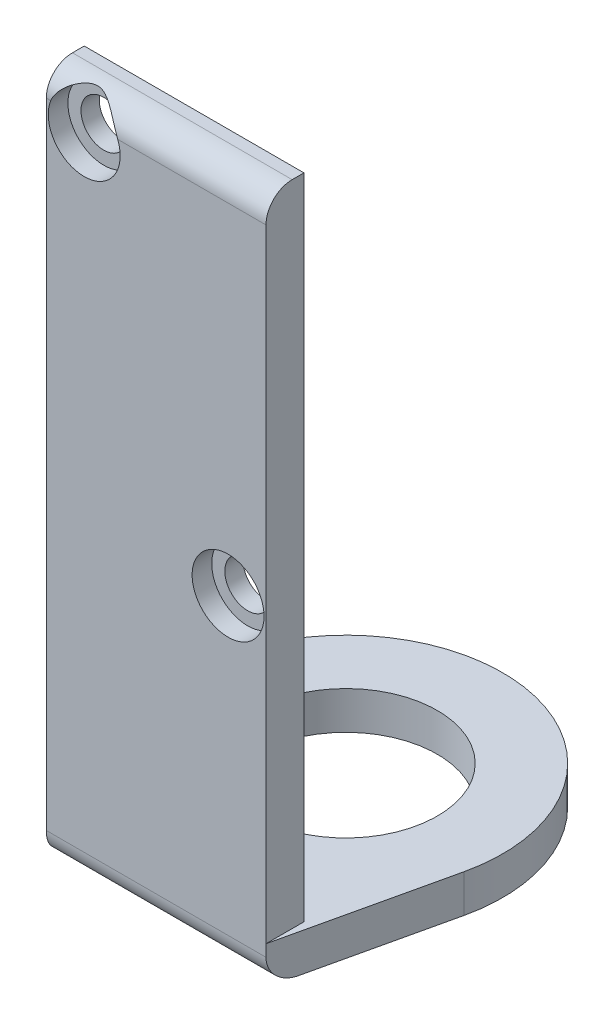
ISO-10303-21;
HEADER;
FILE_DESCRIPTION(('STEP AP214'),'2;1');
FILE_NAME('part.step','',(''),(''),'','','');
FILE_SCHEMA(('AUTOMOTIVE_DESIGN { 1 0 10303 214 1 1 1 1 }'));
ENDSEC;
DATA;
#1=APPLICATION_CONTEXT('core data for automotive mechanical design processes');
#2=APPLICATION_PROTOCOL_DEFINITION('international standard','automotive_design',2000,#1);
#3=PRODUCT_CONTEXT('',#1,'mechanical');
#4=PRODUCT('Part','Part','',(#3));
#5=PRODUCT_RELATED_PRODUCT_CATEGORY('part','',(#4));
#6=PRODUCT_DEFINITION_FORMATION('','',#4);
#7=PRODUCT_DEFINITION_CONTEXT('part definition',#1,'design');
#8=PRODUCT_DEFINITION('design','',#6,#7);
#9=PRODUCT_DEFINITION_SHAPE('','',#8);
#10=(LENGTH_UNIT() NAMED_UNIT(*) SI_UNIT(.MILLI.,.METRE.));
#11=(NAMED_UNIT(*) PLANE_ANGLE_UNIT() SI_UNIT($,.RADIAN.));
#12=(NAMED_UNIT(*) SI_UNIT($,.STERADIAN.) SOLID_ANGLE_UNIT());
#13=UNCERTAINTY_MEASURE_WITH_UNIT(LENGTH_MEASURE(1.E-05),#10,'distance_accuracy_value','');
#14=(GEOMETRIC_REPRESENTATION_CONTEXT(3) GLOBAL_UNCERTAINTY_ASSIGNED_CONTEXT((#13)) GLOBAL_UNIT_ASSIGNED_CONTEXT((#10,
#11,#12)) REPRESENTATION_CONTEXT('',''));
#15=CARTESIAN_POINT('',(0.,0.,0.));
#16=DIRECTION('',(0.,0.,1.));
#17=DIRECTION('',(1.,0.,0.));
#18=AXIS2_PLACEMENT_3D('',#15,#16,#17);
#19=CARTESIAN_POINT('',(2.86441659327707,-36.2659463247865,1.00000000000016));
#20=DIRECTION('',(-1.,0.,0.));
#21=DIRECTION('',(0.,0.,1.));
#22=AXIS2_PLACEMENT_3D('',#19,#20,#21);
#23=PLANE('',#22);
#24=DIRECTION('',(0.,1.,0.));
#25=VECTOR('',#24,1.);
#26=CARTESIAN_POINT('',(2.86441659327707,-36.2659463247865,3.00000000000017));
#27=LINE('',#26,#25);
#28=CARTESIAN_POINT('',(2.86441659327708,-16.3174859837467,3.00000000000022));
#29=VERTEX_POINT('',#28);
#30=CARTESIAN_POINT('',(2.86441659327706,31.2825140162684,3.00000000000017));
#31=VERTEX_POINT('',#30);
#32=EDGE_CURVE('E125',#29,#31,#27,.T.);
#33=ORIENTED_EDGE('',*,*,#32,.T.);
#34=CARTESIAN_POINT('',(2.86441659327706,31.2825140162684,1.00000000000017));
#35=DIRECTION('',(-1.,0.,0.));
#36=DIRECTION('',(0.,0.,1.));
#37=AXIS2_PLACEMENT_3D('',#34,#35,#36);
#38=CIRCLE('',#37,2.);
#39=CARTESIAN_POINT('',(2.86441659327706,33.2825140162684,1.00000000000017));
#40=VERTEX_POINT('',#39);
#41=EDGE_CURVE('E11',#31,#40,#38,.T.);
#42=ORIENTED_EDGE('',*,*,#41,.T.);
#43=DIRECTION('',(0.,0.,1.));
#44=VECTOR('',#43,1.);
#45=CARTESIAN_POINT('',(2.86441659327706,33.2825140162684,1.00000000000016));
#46=LINE('',#45,#44);
#47=CARTESIAN_POINT('',(2.86441659327706,33.2825140162684,0.100000000000007));
#48=VERTEX_POINT('',#47);
#49=EDGE_CURVE('E156',#48,#40,#46,.T.);
#50=ORIENTED_EDGE('',*,*,#49,.F.);
#51=DIRECTION('',(0.,1.,0.));
#52=VECTOR('',#51,1.);
#53=CARTESIAN_POINT('',(2.86441659327707,-36.2659463247865,0.100000000000007));
#54=LINE('',#53,#52);
#55=CARTESIAN_POINT('',(2.86441659327706,-16.3174859837467,0.100000000000007));
#56=VERTEX_POINT('',#55);
#57=EDGE_CURVE('E140',#56,#48,#54,.T.);
#58=ORIENTED_EDGE('',*,*,#57,.F.);
#59=DIRECTION('',(0.,0.,1.));
#60=VECTOR('',#59,1.);
#61=CARTESIAN_POINT('',(2.86441659327707,-16.3174859837467,1.00000000000014));
#62=LINE('',#61,#60);
#63=EDGE_CURVE('E131',#56,#29,#62,.T.);
#64=ORIENTED_EDGE('',*,*,#63,.T.);
#65=EDGE_LOOP('',(#33,#42,#50,#58,#64));
#66=FACE_BOUND('',#65,.T.);
#67=ADVANCED_FACE('F35',(#66),#23,.T.);
#68=CARTESIAN_POINT('',(19.6644165932771,-36.2659463247865,0.100000000000003));
#69=DIRECTION('',(0.,0.,-1.));
#70=DIRECTION('',(-1.,0.,0.));
#71=AXIS2_PLACEMENT_3D('',#68,#69,#70);
#72=PLANE('',#71);
#73=CARTESIAN_POINT('',(16.7644165932771,5.28251401626884,0.100000000000004));
#74=DIRECTION('',(0.,0.,-1.));
#75=DIRECTION('',(-1.,0.,0.));
#76=AXIS2_PLACEMENT_3D('',#73,#74,#75);
#77=CIRCLE('',#76,1.75000000000938);
#78=CARTESIAN_POINT('',(15.0144165932677,5.28251401626884,0.100000000000004));
#79=VERTEX_POINT('',#78);
#80=EDGE_CURVE('E160',#79,#79,#77,.F.);
#81=ORIENTED_EDGE('',*,*,#80,.T.);
#82=EDGE_LOOP('',(#81));
#83=FACE_BOUND('',#82,.T.);
#84=CARTESIAN_POINT('',(5.76441659327706,30.2825140162684,0.100000000000006));
#85=DIRECTION('',(0.,0.,-1.));
#86=DIRECTION('',(-1.,0.,0.));
#87=AXIS2_PLACEMENT_3D('',#84,#85,#86);
#88=CIRCLE('',#87,1.75000000000939);
#89=CARTESIAN_POINT('',(4.01441659326767,30.2825140162684,0.100000000000006));
#90=VERTEX_POINT('',#89);
#91=EDGE_CURVE('E270',#90,#90,#88,.F.);
#92=ORIENTED_EDGE('',*,*,#91,.T.);
#93=EDGE_LOOP('',(#92));
#94=FACE_BOUND('',#93,.T.);
#95=DIRECTION('',(0.,1.,0.));
#96=VECTOR('',#95,1.);
#97=CARTESIAN_POINT('',(19.6644165932771,-36.2659463247865,0.100000000000003));
#98=LINE('',#97,#96);
#99=CARTESIAN_POINT('',(19.6644165932771,-16.3174859837467,0.100000000000003));
#100=VERTEX_POINT('',#99);
#101=CARTESIAN_POINT('',(19.6644165932771,33.2825140162684,0.100000000000003));
#102=VERTEX_POINT('',#101);
#103=EDGE_CURVE('E148',#100,#102,#98,.T.);
#104=ORIENTED_EDGE('',*,*,#103,.F.);
#105=DIRECTION('',(-1.,0.,0.));
#106=VECTOR('',#105,1.);
#107=CARTESIAN_POINT('',(19.6644165932771,-16.3174859837467,0.100000000000003));
#108=LINE('',#107,#106);
#109=EDGE_CURVE('E142',#100,#56,#108,.T.);
#110=ORIENTED_EDGE('',*,*,#109,.T.);
#111=ORIENTED_EDGE('',*,*,#57,.T.);
#112=DIRECTION('',(-1.,0.,0.));
#113=VECTOR('',#112,1.);
#114=CARTESIAN_POINT('',(19.6644165932771,33.2825140162684,0.100000000000003));
#115=LINE('',#114,#113);
#116=EDGE_CURVE('E275',#102,#48,#115,.T.);
#117=ORIENTED_EDGE('',*,*,#116,.F.);
#118=EDGE_LOOP('',(#104,#110,#111,#117));
#119=FACE_BOUND('',#118,.T.);
#120=ADVANCED_FACE('F218',(#83,#94,#119),#72,.T.);
#121=CARTESIAN_POINT('',(19.6644165932771,-36.2659463247865,1.00000000000015));
#122=DIRECTION('',(1.,0.,0.));
#123=DIRECTION('',(0.,1.,0.));
#124=AXIS2_PLACEMENT_3D('',#121,#122,#123);
#125=PLANE('',#124);
#126=DIRECTION('',(0.,0.,-1.));
#127=VECTOR('',#126,1.);
#128=CARTESIAN_POINT('',(19.6644165932771,33.2825140162684,1.00000000000015));
#129=LINE('',#128,#127);
#130=CARTESIAN_POINT('',(19.6644165932771,33.2825140162684,1.00000000000017));
#131=VERTEX_POINT('',#130);
#132=EDGE_CURVE('E273',#131,#102,#129,.T.);
#133=ORIENTED_EDGE('',*,*,#132,.F.);
#134=CARTESIAN_POINT('',(19.6644165932771,31.2825140162684,1.00000000000017));
#135=DIRECTION('',(1.,0.,0.));
#136=DIRECTION('',(0.,1.,0.));
#137=AXIS2_PLACEMENT_3D('',#134,#135,#136);
#138=CIRCLE('',#137,2.);
#139=CARTESIAN_POINT('',(19.6644165932771,31.2825140162684,3.00000000000017));
#140=VERTEX_POINT('',#139);
#141=EDGE_CURVE('E57',#131,#140,#138,.T.);
#142=ORIENTED_EDGE('',*,*,#141,.T.);
#143=DIRECTION('',(0.,1.,0.));
#144=VECTOR('',#143,1.);
#145=CARTESIAN_POINT('',(19.6644165932771,-36.2659463247865,3.00000000000017));
#146=LINE('',#145,#144);
#147=CARTESIAN_POINT('',(19.6644165932771,-16.3174859837467,3.00000000000017));
#148=VERTEX_POINT('',#147);
#149=EDGE_CURVE('E124',#148,#140,#146,.T.);
#150=ORIENTED_EDGE('',*,*,#149,.F.);
#151=DIRECTION('',(0.,0.,-1.));
#152=VECTOR('',#151,1.);
#153=CARTESIAN_POINT('',(19.6644165932771,-16.3174859837467,1.00000000000013));
#154=LINE('',#153,#152);
#155=EDGE_CURVE('E167',#148,#100,#154,.T.);
#156=ORIENTED_EDGE('',*,*,#155,.T.);
#157=ORIENTED_EDGE('',*,*,#103,.T.);
#158=EDGE_LOOP('',(#133,#142,#150,#156,#157));
#159=FACE_BOUND('',#158,.T.);
#160=ADVANCED_FACE('F200',(#159),#125,.T.);
#161=CARTESIAN_POINT('',(16.7644165932771,5.28251401626884,0.0990000000000036));
#162=DIRECTION('',(0.,0.,1.));
#163=DIRECTION('',(1.,0.,0.));
#164=AXIS2_PLACEMENT_3D('',#161,#162,#163);
#165=CYLINDRICAL_SURFACE('',#164,1.75000000000938);
#166=ORIENTED_EDGE('',*,*,#80,.F.);
#167=EDGE_LOOP('',(#166));
#168=FACE_BOUND('',#167,.T.);
#169=CARTESIAN_POINT('',(16.7644165932771,5.28251401626884,1.50000000000017));
#170=DIRECTION('',(0.,0.,1.));
#171=DIRECTION('',(1.,0.,0.));
#172=AXIS2_PLACEMENT_3D('',#169,#170,#171);
#173=CIRCLE('',#172,1.75000000000938);
#174=CARTESIAN_POINT('',(18.5144165932865,5.28251401626884,1.50000000000017));
#175=VERTEX_POINT('',#174);
#176=EDGE_CURVE('E162',#175,#175,#173,.F.);
#177=ORIENTED_EDGE('',*,*,#176,.F.);
#178=EDGE_LOOP('',(#177));
#179=FACE_BOUND('',#178,.T.);
#180=ADVANCED_FACE('F196',(#168,#179),#165,.F.);
#181=CARTESIAN_POINT('',(5.76441659327706,30.2825140162684,0.0990000000000036));
#182=DIRECTION('',(0.,0.,1.));
#183=DIRECTION('',(1.,0.,0.));
#184=AXIS2_PLACEMENT_3D('',#181,#182,#183);
#185=CYLINDRICAL_SURFACE('',#184,1.75000000000939);
#186=ORIENTED_EDGE('',*,*,#91,.F.);
#187=EDGE_LOOP('',(#186));
#188=FACE_BOUND('',#187,.T.);
#189=CARTESIAN_POINT('',(5.76441659327706,30.2825140162684,1.50000000000017));
#190=DIRECTION('',(0.,0.,1.));
#191=DIRECTION('',(1.,0.,0.));
#192=AXIS2_PLACEMENT_3D('',#189,#190,#191);
#193=CIRCLE('',#192,1.75000000000939);
#194=CARTESIAN_POINT('',(7.51441659328646,30.2825140162684,1.50000000000017));
#195=VERTEX_POINT('',#194);
#196=EDGE_CURVE('E157',#195,#195,#193,.F.);
#197=ORIENTED_EDGE('',*,*,#196,.F.);
#198=EDGE_LOOP('',(#197));
#199=FACE_BOUND('',#198,.T.);
#200=ADVANCED_FACE('F199',(#188,#199),#185,.F.);
#201=CARTESIAN_POINT('',(19.6644165932771,-36.2659463247865,3.00000000000017));
#202=DIRECTION('',(0.,0.,1.));
#203=DIRECTION('',(1.,0.,0.));
#204=AXIS2_PLACEMENT_3D('',#201,#202,#203);
#205=PLANE('',#204);
#206=CARTESIAN_POINT('',(16.7644165932771,5.28251401626884,3.00000000000017));
#207=DIRECTION('',(0.,0.,1.));
#208=DIRECTION('',(1.,0.,0.));
#209=AXIS2_PLACEMENT_3D('',#206,#207,#208);
#210=CIRCLE('',#209,2.75000000000939);
#211=CARTESIAN_POINT('',(19.5144165932865,5.28251401626884,3.00000000000017));
#212=VERTEX_POINT('',#211);
#213=EDGE_CURVE('E141',#212,#212,#210,.T.);
#214=ORIENTED_EDGE('',*,*,#213,.F.);
#215=EDGE_LOOP('',(#214));
#216=FACE_BOUND('',#215,.T.);
#217=CARTESIAN_POINT('',(2.86441659327707,-17.2174859837469,3.00000000000017));
#218=VERTEX_POINT('',#217);
#219=EDGE_CURVE('E114',#218,#29,#27,.T.);
#220=ORIENTED_EDGE('',*,*,#219,.F.);
#221=DIRECTION('',(-1.,0.,0.));
#222=VECTOR('',#221,1.);
#223=CARTESIAN_POINT('',(19.6644165932771,-17.2174859837468,3.00000000000017));
#224=LINE('',#223,#222);
#225=CARTESIAN_POINT('',(19.6644165932771,-17.2174859837468,3.00000000000017));
#226=VERTEX_POINT('',#225);
#227=EDGE_CURVE('E177',#218,#226,#224,.F.);
#228=ORIENTED_EDGE('',*,*,#227,.T.);
#229=EDGE_CURVE('E151',#226,#148,#146,.T.);
#230=ORIENTED_EDGE('',*,*,#229,.T.);
#231=ORIENTED_EDGE('',*,*,#149,.T.);
#232=DIRECTION('',(1.,0.,0.));
#233=VECTOR('',#232,1.);
#234=CARTESIAN_POINT('',(2.86441659327706,31.2825140162684,3.00000000000017));
#235=LINE('',#234,#233);
#236=CARTESIAN_POINT('',(8.32615428477705,31.2825140162684,3.00000000000017));
#237=VERTEX_POINT('',#236);
#238=EDGE_CURVE('E175',#140,#237,#235,.F.);
#239=ORIENTED_EDGE('',*,*,#238,.T.);
#240=CARTESIAN_POINT('',(5.76441659327706,30.2825140162684,3.00000000000017));
#241=DIRECTION('',(0.,0.,1.));
#242=DIRECTION('',(1.,0.,0.));
#243=AXIS2_PLACEMENT_3D('',#240,#241,#242);
#244=CIRCLE('',#243,2.75000000000939);
#245=CARTESIAN_POINT('',(3.20267890177708,31.2825140162684,3.00000000000017));
#246=VERTEX_POINT('',#245);
#247=EDGE_CURVE('E165',#246,#237,#244,.T.);
#248=ORIENTED_EDGE('',*,*,#247,.F.);
#249=DIRECTION('',(1.,0.,0.));
#250=VECTOR('',#249,1.);
#251=CARTESIAN_POINT('',(2.86441659327706,31.2825140162684,3.00000000000017));
#252=LINE('',#251,#250);
#253=EDGE_CURVE('E147',#246,#31,#252,.F.);
#254=ORIENTED_EDGE('',*,*,#253,.T.);
#255=ORIENTED_EDGE('',*,*,#32,.F.);
#256=EDGE_LOOP('',(#220,#228,#230,#231,#239,#248,#254,#255));
#257=FACE_BOUND('',#256,.T.);
#258=ADVANCED_FACE('F144',(#216,#257),#205,.T.);
#259=CARTESIAN_POINT('',(0.,33.2825140162684,0.));
#260=DIRECTION('',(0.,-1.,0.));
#261=DIRECTION('',(0.,0.,-1.));
#262=AXIS2_PLACEMENT_3D('',#259,#260,#261);
#263=PLANE('',#262);
#264=ORIENTED_EDGE('',*,*,#49,.T.);
#265=DIRECTION('',(1.,0.,0.));
#266=VECTOR('',#265,1.);
#267=CARTESIAN_POINT('',(19.6644165932771,33.2825140162684,1.00000000000017));
#268=LINE('',#267,#266);
#269=EDGE_CURVE('E181',#40,#131,#268,.T.);
#270=ORIENTED_EDGE('',*,*,#269,.T.);
#271=ORIENTED_EDGE('',*,*,#132,.T.);
#272=ORIENTED_EDGE('',*,*,#116,.T.);
#273=EDGE_LOOP('',(#264,#270,#271,#272));
#274=FACE_BOUND('',#273,.T.);
#275=ADVANCED_FACE('F208',(#274),#263,.F.);
#276=CARTESIAN_POINT('',(10.7644165932771,-19.2174859837469,-12.));
#277=DIRECTION('',(0.,1.,0.));
#278=DIRECTION('',(0.,0.,-1.));
#279=AXIS2_PLACEMENT_3D('',#276,#277,#278);
#280=PLANE('',#279);
#281=DIRECTION('',(0.22139002929465,0.,-0.975185343885415));
#282=VECTOR('',#281,1.);
#283=CARTESIAN_POINT('',(19.6644165932771,-19.2174859837468,3.00000000000022));
#284=LINE('',#283,#282);
#285=CARTESIAN_POINT('',(20.1184636740352,-19.2174859837469,1.00000000000017));
#286=VERTEX_POINT('',#285);
#287=CARTESIAN_POINT('',(22.466640719902,-19.2174859837469,-9.3433196484642));
#288=VERTEX_POINT('',#287);
#289=EDGE_CURVE('E242',#286,#288,#284,.T.);
#290=ORIENTED_EDGE('',*,*,#289,.F.);
#291=DIRECTION('',(-1.,0.,0.));
#292=VECTOR('',#291,1.);
#293=CARTESIAN_POINT('',(2.86441659327708,-19.2174859837469,1.00000000000017));
#294=LINE('',#293,#292);
#295=CARTESIAN_POINT('',(2.24207839057973,-19.2174859837469,1.00000000000017));
#296=VERTEX_POINT('',#295);
#297=EDGE_CURVE('E170',#286,#296,#294,.T.);
#298=ORIENTED_EDGE('',*,*,#297,.T.);
#299=DIRECTION('',(0.297117037231068,0.,0.9548410685486));
#300=VECTOR('',#299,1.);
#301=CARTESIAN_POINT('',(2.86441659327708,-19.2174859837469,3.00000000000022));
#302=LINE('',#301,#300);
#303=CARTESIAN_POINT('',(-0.693676229306148,-19.2174859837469,-8.43459555322717));
#304=VERTEX_POINT('',#303);
#305=EDGE_CURVE('E248',#304,#296,#302,.T.);
#306=ORIENTED_EDGE('',*,*,#305,.F.);
#307=CARTESIAN_POINT('',(10.7644165932771,-19.2174859837469,-12.));
#308=DIRECTION('',(0.,1.,0.));
#309=DIRECTION('',(0.,0.,-1.));
#310=AXIS2_PLACEMENT_3D('',#307,#308,#309);
#311=CIRCLE('',#310,12.);
#312=EDGE_CURVE('E137',#288,#304,#311,.T.);
#313=ORIENTED_EDGE('',*,*,#312,.F.);
#314=EDGE_LOOP('',(#290,#298,#306,#313));
#315=FACE_BOUND('',#314,.T.);
#316=CARTESIAN_POINT('',(10.7644165932771,-19.2174859837469,-12.));
#317=DIRECTION('',(0.,1.,0.));
#318=DIRECTION('',(0.,0.,1.));
#319=AXIS2_PLACEMENT_3D('',#316,#317,#318);
#320=CIRCLE('',#319,7.);
#321=CARTESIAN_POINT('',(10.7644165932771,-19.2174859837469,-4.99999999999999));
#322=VERTEX_POINT('',#321);
#323=EDGE_CURVE('E289',#322,#322,#320,.T.);
#324=ORIENTED_EDGE('',*,*,#323,.T.);
#325=EDGE_LOOP('',(#324));
#326=FACE_BOUND('',#325,.T.);
#327=ADVANCED_FACE('F205',(#315,#326),#280,.F.);
#328=CARTESIAN_POINT('',(5.76441659327706,30.2825140162684,1.50000000000017));
#329=DIRECTION('',(0.,0.,1.));
#330=DIRECTION('',(1.,0.,0.));
#331=AXIS2_PLACEMENT_3D('',#328,#329,#330);
#332=PLANE('',#331);
#333=CARTESIAN_POINT('',(5.76441659327706,30.2825140162684,1.50000000000017));
#334=DIRECTION('',(0.,0.,1.));
#335=DIRECTION('',(1.,0.,0.));
#336=AXIS2_PLACEMENT_3D('',#333,#334,#335);
#337=CIRCLE('',#336,2.75000000000939);
#338=CARTESIAN_POINT('',(8.51441659328646,30.2825140162684,1.50000000000017));
#339=VERTEX_POINT('',#338);
#340=EDGE_CURVE('E161',#339,#339,#337,.T.);
#341=ORIENTED_EDGE('',*,*,#340,.T.);
#342=EDGE_LOOP('',(#341));
#343=FACE_BOUND('',#342,.T.);
#344=ORIENTED_EDGE('',*,*,#196,.T.);
#345=EDGE_LOOP('',(#344));
#346=FACE_BOUND('',#345,.T.);
#347=ADVANCED_FACE('F193',(#343,#346),#332,.T.);
#348=CARTESIAN_POINT('',(5.76441659327706,30.2825140162684,1.50000000000017));
#349=DIRECTION('',(0.,0.,1.));
#350=DIRECTION('',(1.,0.,0.));
#351=AXIS2_PLACEMENT_3D('',#348,#349,#350);
#352=CYLINDRICAL_SURFACE('',#351,2.75000000000939);
#353=ORIENTED_EDGE('',*,*,#340,.F.);
#354=EDGE_LOOP('',(#353));
#355=FACE_BOUND('',#354,.T.);
#356=ORIENTED_EDGE('',*,*,#247,.T.);
#357=CARTESIAN_POINT('',(8.32615428477705,31.2825140162684,3.00000000000017));
#358=CARTESIAN_POINT('',(8.30452704338385,31.337955904378,3.00000852369248));
#359=CARTESIAN_POINT('',(8.28108826760631,31.3926506547487,2.99769560487753));
#360=CARTESIAN_POINT('',(8.2309105158485,31.5000501880547,2.98886062477013));
#361=CARTESIAN_POINT('',(8.20417700900173,31.552758084086,2.98234546490591));
#362=CARTESIAN_POINT('',(8.14797340233813,31.6553006417317,2.96563019209358));
#363=CARTESIAN_POINT('',(8.11853694653143,31.705160688803,2.95547175494778));
#364=CARTESIAN_POINT('',(8.05696592038308,31.8023936199306,2.93189807840198));
#365=CARTESIAN_POINT('',(8.02483001968921,31.8497652587252,2.91848122694317));
#366=CARTESIAN_POINT('',(7.90900080611989,32.0096469444378,2.86696864585786));
#367=CARTESIAN_POINT('',(7.8190449810413,32.1153993070348,2.82161649066803));
#368=CARTESIAN_POINT('',(7.62734994122991,32.3100317653604,2.71941460914379));
#369=CARTESIAN_POINT('',(7.52554576098561,32.3988110374076,2.6625000821187));
#370=CARTESIAN_POINT('',(7.35127247501579,32.5300862435124,2.56448754168371));
#371=CARTESIAN_POINT('',(7.2815719218968,32.5776836338784,2.52514916290871));
#372=CARTESIAN_POINT('',(7.13848990763934,32.666104591524,2.44541371780702));
#373=CARTESIAN_POINT('',(7.06510622379961,32.7069240028232,2.40501601939601));
#374=CARTESIAN_POINT('',(6.91477503305728,32.7817574866422,2.32486501830934));
#375=CARTESIAN_POINT('',(6.83783286686256,32.815781374497,2.28511086356218));
#376=CARTESIAN_POINT('',(6.68003705868164,32.8769881543482,2.2083271538364));
#377=CARTESIAN_POINT('',(6.59918751241171,32.9041780319641,2.17129484426193));
#378=CARTESIAN_POINT('',(6.43546947698561,32.9506989041242,2.10398443229681));
#379=CARTESIAN_POINT('',(6.35273264495456,32.9702396692088,2.07353814371694));
#380=CARTESIAN_POINT('',(6.18315619938617,33.0018059480607,2.02222689994584));
#381=CARTESIAN_POINT('',(6.09633490415207,33.0138621090101,2.00132296611917));
#382=CARTESIAN_POINT('',(5.918098418569,33.0296869662474,1.97349161524413));
#383=CARTESIAN_POINT('',(5.82663230513074,33.0333216470894,1.96679035335539));
#384=CARTESIAN_POINT('',(5.64408734731845,33.0313993624084,1.97025612413238));
#385=CARTESIAN_POINT('',(5.55300886501071,33.0258351498295,1.98043645644484));
#386=CARTESIAN_POINT('',(5.35854900237038,33.0044696128244,2.01752643787803));
#387=CARTESIAN_POINT('',(5.25590831886375,32.9870041720115,2.04712024505191));
#388=CARTESIAN_POINT('',(5.05656228170143,32.9418343343866,2.11731478208368));
#389=CARTESIAN_POINT('',(4.95989152239799,32.9140757984321,2.15797340371131));
#390=CARTESIAN_POINT('',(4.78604386035443,32.8539797604965,2.23799647096404));
#391=CARTESIAN_POINT('',(4.70809186550209,32.8229174042064,2.27667072414631));
#392=CARTESIAN_POINT('',(4.5558517198757,32.7541237068913,2.35539637526769));
#393=CARTESIAN_POINT('',(4.4815659655352,32.7163880758425,2.39544864566629));
#394=CARTESIAN_POINT('',(4.33663575646437,32.6342932123739,2.47511505071361));
#395=CARTESIAN_POINT('',(4.26598711662967,32.5899418324789,2.51472964578124));
#396=CARTESIAN_POINT('',(4.12835305228039,32.4944836735656,2.59213957802046));
#397=CARTESIAN_POINT('',(4.06136769259927,32.4433767750416,2.62993488299248));
#398=CARTESIAN_POINT('',(3.90138683845221,32.3090865007862,2.71910066058679));
#399=CARTESIAN_POINT('',(3.81062911715411,32.2219740661301,2.76870136314684));
#400=CARTESIAN_POINT('',(3.63993798046842,32.0332770377424,2.85664637705634));
#401=CARTESIAN_POINT('',(3.55995931896675,31.9317568607724,2.89503858326532));
#402=CARTESIAN_POINT('',(3.43067515146286,31.7406360633689,2.94871728272862));
#403=CARTESIAN_POINT('',(3.37858629614221,31.6538818970884,2.96731915110423));
#404=CARTESIAN_POINT('',(3.30728471081157,31.5184913189292,2.98655960537461));
#405=CARTESIAN_POINT('',(3.28457488141028,31.4722780624481,2.99153175714972));
#406=CARTESIAN_POINT('',(3.24168079361082,31.3784048565201,2.99825536698567));
#407=CARTESIAN_POINT('',(3.22149945946799,31.3307433097903,3.0000031274438));
#408=CARTESIAN_POINT('',(3.20267890177708,31.2825140162684,3.00000000000017));
#409=B_SPLINE_CURVE_WITH_KNOTS('',3,(#357,#358,#359,#360,#361,#362,#363,#364,#365,#366,#367,
#368,#369,#370,#371,#372,#373,#374,#375,#376,#377,#378,#379,#380,#381,#382,#383,#384,#385,#386,
#387,#388,#389,#390,#391,#392,#393,#394,#395,#396,#397,#398,#399,#400,#401,#402,#403,#404,#405,
#406,#407,#408),.UNSPECIFIED.,.F.,.F.,(4,2,2,2,2,2,2,2,2,2,2,2,2,2,2,2,2,2,2,2,2,2,2,2,2,4),(0.,
0.178400172094682,0.356508097326478,0.532640415661562,0.708860051360818,1.14446861768259,
1.58258943914762,1.86164734563551,2.14087573222393,2.41969784223201,2.69823377476327,
2.96848176772644,3.23761574955367,3.51100402923823,3.7846077918436,4.10751728460334,
4.43214986626284,4.70900533173949,4.9860394296044,5.26274728211638,5.53946003027491,
5.94368044090571,6.34614741685465,6.65357405353709,6.80860273632975,6.96380908955771),.UNSPECIFIED.);
#410=EDGE_CURVE('E44',#237,#246,#409,.T.);
#411=ORIENTED_EDGE('',*,*,#410,.T.);
#412=EDGE_LOOP('',(#356,#411));
#413=FACE_BOUND('',#412,.T.);
#414=ADVANCED_FACE('F187',(#355,#413),#352,.F.);
#415=CARTESIAN_POINT('',(16.7644165932771,5.28251401626884,1.50000000000017));
#416=DIRECTION('',(0.,0.,1.));
#417=DIRECTION('',(1.,0.,0.));
#418=AXIS2_PLACEMENT_3D('',#415,#416,#417);
#419=PLANE('',#418);
#420=CARTESIAN_POINT('',(16.7644165932771,5.28251401626884,1.50000000000017));
#421=DIRECTION('',(0.,0.,1.));
#422=DIRECTION('',(1.,0.,0.));
#423=AXIS2_PLACEMENT_3D('',#420,#421,#422);
#424=CIRCLE('',#423,2.75000000000939);
#425=CARTESIAN_POINT('',(19.5144165932865,5.28251401626884,1.50000000000017));
#426=VERTEX_POINT('',#425);
#427=EDGE_CURVE('E166',#426,#426,#424,.T.);
#428=ORIENTED_EDGE('',*,*,#427,.T.);
#429=EDGE_LOOP('',(#428));
#430=FACE_BOUND('',#429,.T.);
#431=ORIENTED_EDGE('',*,*,#176,.T.);
#432=EDGE_LOOP('',(#431));
#433=FACE_BOUND('',#432,.T.);
#434=ADVANCED_FACE('F192',(#430,#433),#419,.T.);
#435=CARTESIAN_POINT('',(16.7644165932771,5.28251401626884,1.50000000000017));
#436=DIRECTION('',(0.,0.,1.));
#437=DIRECTION('',(1.,0.,0.));
#438=AXIS2_PLACEMENT_3D('',#435,#436,#437);
#439=CYLINDRICAL_SURFACE('',#438,2.75000000000939);
#440=ORIENTED_EDGE('',*,*,#427,.F.);
#441=EDGE_LOOP('',(#440));
#442=FACE_BOUND('',#441,.T.);
#443=ORIENTED_EDGE('',*,*,#213,.T.);
#444=EDGE_LOOP('',(#443));
#445=FACE_BOUND('',#444,.T.);
#446=ADVANCED_FACE('F296',(#442,#445),#439,.F.);
#447=CARTESIAN_POINT('',(10.764416593277,-16.3174859837467,-12.));
#448=DIRECTION('',(0.,-1.,0.));
#449=DIRECTION('',(0.,0.,-1.));
#450=AXIS2_PLACEMENT_3D('',#447,#448,#449);
#451=PLANE('',#450);
#452=ORIENTED_EDGE('',*,*,#63,.F.);
#453=ORIENTED_EDGE('',*,*,#109,.F.);
#454=ORIENTED_EDGE('',*,*,#155,.F.);
#455=DIRECTION('',(0.22139002929465,0.,-0.975185343885415));
#456=VECTOR('',#455,1.);
#457=CARTESIAN_POINT('',(19.6644165932771,-16.3174859837467,3.00000000000021));
#458=LINE('',#457,#456);
#459=CARTESIAN_POINT('',(22.466640719902,-16.3174859837467,-9.3433196484642));
#460=VERTEX_POINT('',#459);
#461=EDGE_CURVE('E136',#148,#460,#458,.T.);
#462=ORIENTED_EDGE('',*,*,#461,.T.);
#463=CARTESIAN_POINT('',(10.764416593277,-16.3174859837467,-12.));
#464=DIRECTION('',(0.,1.,0.));
#465=DIRECTION('',(0.,0.,-1.));
#466=AXIS2_PLACEMENT_3D('',#463,#464,#465);
#467=CIRCLE('',#466,12.);
#468=CARTESIAN_POINT('',(-0.693676229306149,-16.3174859837467,-8.43459555322717));
#469=VERTEX_POINT('',#468);
#470=EDGE_CURVE('E134',#460,#469,#467,.T.);
#471=ORIENTED_EDGE('',*,*,#470,.T.);
#472=DIRECTION('',(0.297117037231068,0.,0.9548410685486));
#473=VECTOR('',#472,1.);
#474=CARTESIAN_POINT('',(2.86441659327708,-16.3174859837467,3.00000000000022));
#475=LINE('',#474,#473);
#476=EDGE_CURVE('E119',#469,#29,#475,.T.);
#477=ORIENTED_EDGE('',*,*,#476,.T.);
#478=EDGE_LOOP('',(#452,#453,#454,#462,#471,#477));
#479=FACE_BOUND('',#478,.T.);
#480=CARTESIAN_POINT('',(10.7644165932771,-16.3174859837467,-12.));
#481=DIRECTION('',(0.,1.,0.));
#482=DIRECTION('',(0.,0.,1.));
#483=AXIS2_PLACEMENT_3D('',#480,#481,#482);
#484=CIRCLE('',#483,7.);
#485=CARTESIAN_POINT('',(10.7644165932771,-16.3174859837467,-4.99999999999999));
#486=VERTEX_POINT('',#485);
#487=EDGE_CURVE('E251',#486,#486,#484,.T.);
#488=ORIENTED_EDGE('',*,*,#487,.F.);
#489=EDGE_LOOP('',(#488));
#490=FACE_BOUND('',#489,.T.);
#491=ADVANCED_FACE('F129',(#479,#490),#451,.F.);
#492=CARTESIAN_POINT('',(2.86441659327708,-16.3174859837467,3.00000000000022));
#493=DIRECTION('',(0.9548410685486,0.,-0.297117037231068));
#494=DIRECTION('',(-0.297117037231068,0.,-0.9548410685486));
#495=AXIS2_PLACEMENT_3D('',#492,#493,#494);
#496=PLANE('',#495);
#497=ORIENTED_EDGE('',*,*,#305,.T.);
#498=CARTESIAN_POINT('',(2.24207839057973,-17.2174859837469,1.00000000000017));
#499=DIRECTION('',(0.9548410685486,0.,-0.297117037231068));
#500=DIRECTION('',(0.297117037231068,0.,0.9548410685486));
#501=AXIS2_PLACEMENT_3D('',#498,#499,#500);
#502=ELLIPSE('',#501,2.09458942003834,2.);
#503=EDGE_CURVE('E120',#296,#218,#502,.F.);
#504=ORIENTED_EDGE('',*,*,#503,.T.);
#505=ORIENTED_EDGE('',*,*,#219,.T.);
#506=ORIENTED_EDGE('',*,*,#476,.F.);
#507=DIRECTION('',(0.,-1.,0.));
#508=VECTOR('',#507,1.);
#509=CARTESIAN_POINT('',(-0.693676229306149,-16.3174859837467,-8.43459555322717));
#510=LINE('',#509,#508);
#511=EDGE_CURVE('E255',#469,#304,#510,.T.);
#512=ORIENTED_EDGE('',*,*,#511,.T.);
#513=EDGE_LOOP('',(#497,#504,#505,#506,#512));
#514=FACE_BOUND('',#513,.T.);
#515=ADVANCED_FACE('F117',(#514),#496,.F.);
#516=CARTESIAN_POINT('',(19.6644165932771,-16.3174859837467,3.00000000000021));
#517=DIRECTION('',(-0.975185343885414,0.,-0.22139002929465));
#518=DIRECTION('',(-0.22139002929465,0.,0.975185343885415));
#519=AXIS2_PLACEMENT_3D('',#516,#517,#518);
#520=PLANE('',#519);
#521=ORIENTED_EDGE('',*,*,#229,.F.);
#522=CARTESIAN_POINT('',(20.1184636740352,-17.2174859837468,1.00000000000017));
#523=DIRECTION('',(-0.975185343885414,0.,-0.22139002929465));
#524=DIRECTION('',(0.22139002929465,0.,-0.975185343885415));
#525=AXIS2_PLACEMENT_3D('',#522,#523,#524);
#526=ELLIPSE('',#525,2.05089218428102,2.);
#527=EDGE_CURVE('E179',#226,#286,#526,.F.);
#528=ORIENTED_EDGE('',*,*,#527,.T.);
#529=ORIENTED_EDGE('',*,*,#289,.T.);
#530=DIRECTION('',(0.,-1.,0.));
#531=VECTOR('',#530,1.);
#532=CARTESIAN_POINT('',(22.466640719902,-16.3174859837467,-9.3433196484642));
#533=LINE('',#532,#531);
#534=EDGE_CURVE('E257',#460,#288,#533,.T.);
#535=ORIENTED_EDGE('',*,*,#534,.F.);
#536=ORIENTED_EDGE('',*,*,#461,.F.);
#537=EDGE_LOOP('',(#521,#528,#529,#535,#536));
#538=FACE_BOUND('',#537,.T.);
#539=ADVANCED_FACE('F240',(#538),#520,.F.);
#540=CARTESIAN_POINT('',(10.764416593277,-16.3174859837467,-12.));
#541=DIRECTION('',(0.,-1.,0.));
#542=DIRECTION('',(0.,0.,-1.));
#543=AXIS2_PLACEMENT_3D('',#540,#541,#542);
#544=CYLINDRICAL_SURFACE('',#543,12.);
#545=ORIENTED_EDGE('',*,*,#312,.T.);
#546=ORIENTED_EDGE('',*,*,#511,.F.);
#547=ORIENTED_EDGE('',*,*,#470,.F.);
#548=ORIENTED_EDGE('',*,*,#534,.T.);
#549=EDGE_LOOP('',(#545,#546,#547,#548));
#550=FACE_BOUND('',#549,.T.);
#551=ADVANCED_FACE('F232',(#550),#544,.T.);
#552=CARTESIAN_POINT('',(10.7644165932771,-16.3174859837467,-12.));
#553=DIRECTION('',(0.,-1.,0.));
#554=DIRECTION('',(0.,0.,-1.));
#555=AXIS2_PLACEMENT_3D('',#552,#553,#554);
#556=CYLINDRICAL_SURFACE('',#555,7.);
#557=ORIENTED_EDGE('',*,*,#487,.T.);
#558=EDGE_LOOP('',(#557));
#559=FACE_BOUND('',#558,.T.);
#560=ORIENTED_EDGE('',*,*,#323,.F.);
#561=EDGE_LOOP('',(#560));
#562=FACE_BOUND('',#561,.T.);
#563=ADVANCED_FACE('F226',(#559,#562),#556,.F.);
#564=CARTESIAN_POINT('',(10.7644165932771,-17.2174859837469,1.00000000000017));
#565=DIRECTION('',(1.,0.,0.));
#566=DIRECTION('',(0.,1.,0.));
#567=AXIS2_PLACEMENT_3D('',#564,#565,#566);
#568=CYLINDRICAL_SURFACE('',#567,2.);
#569=ORIENTED_EDGE('',*,*,#527,.F.);
#570=ORIENTED_EDGE('',*,*,#227,.F.);
#571=ORIENTED_EDGE('',*,*,#503,.F.);
#572=ORIENTED_EDGE('',*,*,#297,.F.);
#573=EDGE_LOOP('',(#569,#570,#571,#572));
#574=FACE_BOUND('',#573,.T.);
#575=ADVANCED_FACE('F224',(#574),#568,.T.);
#576=CARTESIAN_POINT('',(0.,31.2825140162684,1.00000000000017));
#577=DIRECTION('',(-1.,0.,0.));
#578=DIRECTION('',(0.,0.,1.));
#579=AXIS2_PLACEMENT_3D('',#576,#577,#578);
#580=CYLINDRICAL_SURFACE('',#579,2.);
#581=ORIENTED_EDGE('',*,*,#410,.F.);
#582=ORIENTED_EDGE('',*,*,#238,.F.);
#583=ORIENTED_EDGE('',*,*,#141,.F.);
#584=ORIENTED_EDGE('',*,*,#269,.F.);
#585=ORIENTED_EDGE('',*,*,#41,.F.);
#586=ORIENTED_EDGE('',*,*,#253,.F.);
#587=EDGE_LOOP('',(#581,#582,#583,#584,#585,#586));
#588=FACE_BOUND('',#587,.T.);
#589=ADVANCED_FACE('F37',(#588),#580,.T.);
#590=CLOSED_SHELL('',(#67,#120,#160,#180,#200,#258,#275,#327,#347,#414,#434,#446,#491,#515,#539,
#551,#563,#575,#589));
#591=MANIFOLD_SOLID_BREP('B2',#590);
#592=ADVANCED_BREP_SHAPE_REPRESENTATION('',(#18,#591),#14);
#593=SHAPE_DEFINITION_REPRESENTATION(#9,#592);
ENDSEC;
END-ISO-10303-21;
